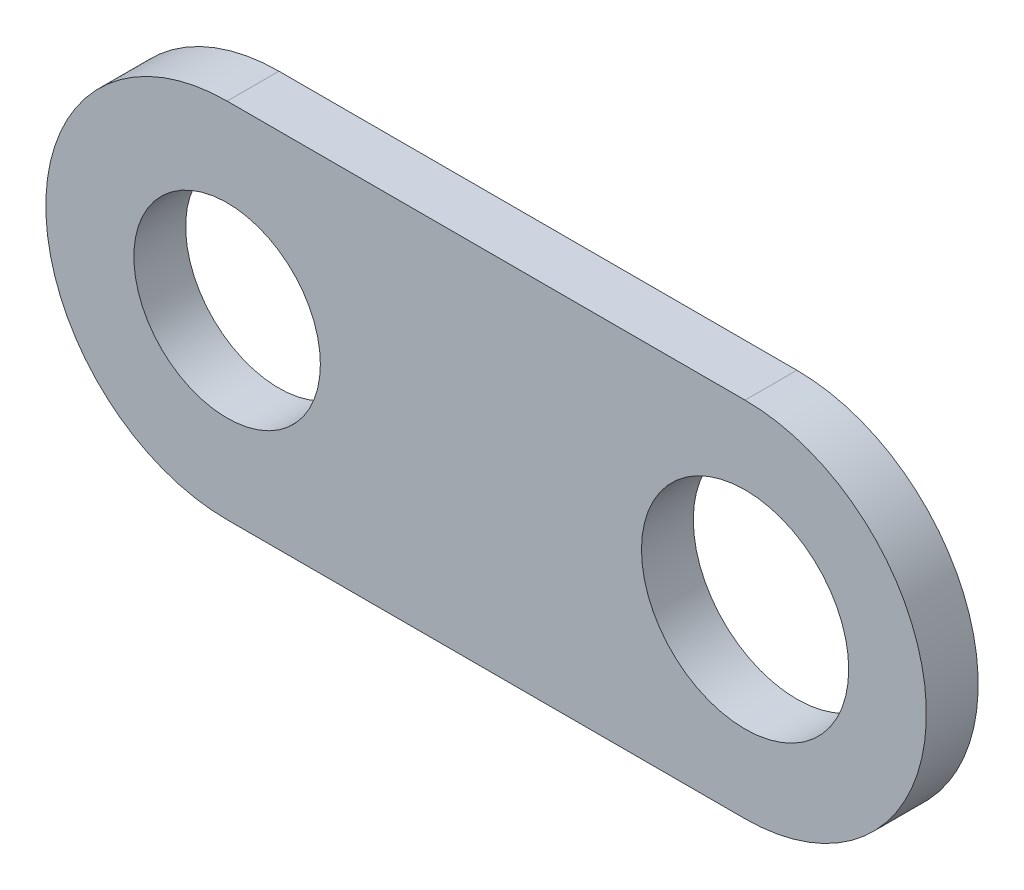
ISO-10303-21;
HEADER;
FILE_DESCRIPTION(('STEP AP214'),'2;1');
FILE_NAME('part.step','',(''),(''),'','','');
FILE_SCHEMA(('AUTOMOTIVE_DESIGN { 1 0 10303 214 1 1 1 1 }'));
ENDSEC;
DATA;
#1=APPLICATION_CONTEXT('core data for automotive mechanical design processes');
#2=APPLICATION_PROTOCOL_DEFINITION('international standard','automotive_design',2000,#1);
#3=PRODUCT_CONTEXT('',#1,'mechanical');
#4=PRODUCT('Part','Part','',(#3));
#5=PRODUCT_RELATED_PRODUCT_CATEGORY('part','',(#4));
#6=PRODUCT_DEFINITION_FORMATION('','',#4);
#7=PRODUCT_DEFINITION_CONTEXT('part definition',#1,'design');
#8=PRODUCT_DEFINITION('design','',#6,#7);
#9=PRODUCT_DEFINITION_SHAPE('','',#8);
#10=(LENGTH_UNIT() NAMED_UNIT(*) SI_UNIT(.MILLI.,.METRE.));
#11=(NAMED_UNIT(*) PLANE_ANGLE_UNIT() SI_UNIT($,.RADIAN.));
#12=(NAMED_UNIT(*) SI_UNIT($,.STERADIAN.) SOLID_ANGLE_UNIT());
#13=UNCERTAINTY_MEASURE_WITH_UNIT(LENGTH_MEASURE(1.E-05),#10,'distance_accuracy_value','');
#14=(GEOMETRIC_REPRESENTATION_CONTEXT(3) GLOBAL_UNCERTAINTY_ASSIGNED_CONTEXT((#13)) GLOBAL_UNIT_ASSIGNED_CONTEXT((#10,
#11,#12)) REPRESENTATION_CONTEXT('',''));
#15=CARTESIAN_POINT('',(0.,0.,0.));
#16=DIRECTION('',(0.,0.,1.));
#17=DIRECTION('',(1.,0.,0.));
#18=AXIS2_PLACEMENT_3D('',#15,#16,#17);
#19=CARTESIAN_POINT('',(0.,0.,6.35));
#20=DIRECTION('',(0.,0.,-1.));
#21=DIRECTION('',(-1.,0.,0.));
#22=AXIS2_PLACEMENT_3D('',#19,#20,#21);
#23=CYLINDRICAL_SURFACE('',#22,22.225);
#24=CARTESIAN_POINT('',(0.,0.,0.));
#25=DIRECTION('',(0.,0.,1.));
#26=DIRECTION('',(1.,0.,0.));
#27=AXIS2_PLACEMENT_3D('',#24,#25,#26);
#28=CIRCLE('',#27,22.225);
#29=CARTESIAN_POINT('',(0.,22.225,0.));
#30=VERTEX_POINT('',#29);
#31=CARTESIAN_POINT('',(0.,-22.225,0.));
#32=VERTEX_POINT('',#31);
#33=EDGE_CURVE('E116',#30,#32,#28,.T.);
#34=ORIENTED_EDGE('',*,*,#33,.T.);
#35=DIRECTION('',(0.,0.,-1.));
#36=VECTOR('',#35,1.);
#37=CARTESIAN_POINT('',(0.,-22.225,6.35));
#38=LINE('',#37,#36);
#39=CARTESIAN_POINT('',(0.,-22.225,6.35));
#40=VERTEX_POINT('',#39);
#41=EDGE_CURVE('E11',#40,#32,#38,.T.);
#42=ORIENTED_EDGE('',*,*,#41,.F.);
#43=CARTESIAN_POINT('',(0.,0.,6.35));
#44=DIRECTION('',(0.,0.,1.));
#45=DIRECTION('',(1.,0.,0.));
#46=AXIS2_PLACEMENT_3D('',#43,#44,#45);
#47=CIRCLE('',#46,22.225);
#48=CARTESIAN_POINT('',(0.,22.225,6.35));
#49=VERTEX_POINT('',#48);
#50=EDGE_CURVE('E99',#49,#40,#47,.T.);
#51=ORIENTED_EDGE('',*,*,#50,.F.);
#52=DIRECTION('',(0.,0.,-1.));
#53=VECTOR('',#52,1.);
#54=CARTESIAN_POINT('',(0.,22.225,6.35));
#55=LINE('',#54,#53);
#56=EDGE_CURVE('E112',#49,#30,#55,.T.);
#57=ORIENTED_EDGE('',*,*,#56,.T.);
#58=EDGE_LOOP('',(#34,#42,#51,#57));
#59=FACE_BOUND('',#58,.T.);
#60=ADVANCED_FACE('F47',(#59),#23,.T.);
#61=CARTESIAN_POINT('',(0.,-22.225,6.35));
#62=DIRECTION('',(0.,1.,0.));
#63=DIRECTION('',(0.,0.,1.));
#64=AXIS2_PLACEMENT_3D('',#61,#62,#63);
#65=PLANE('',#64);
#66=DIRECTION('',(1.,0.,0.));
#67=VECTOR('',#66,1.);
#68=CARTESIAN_POINT('',(0.,-22.225,0.));
#69=LINE('',#68,#67);
#70=CARTESIAN_POINT('',(63.5,-22.225,0.));
#71=VERTEX_POINT('',#70);
#72=EDGE_CURVE('E104',#32,#71,#69,.T.);
#73=ORIENTED_EDGE('',*,*,#72,.T.);
#74=DIRECTION('',(0.,0.,-1.));
#75=VECTOR('',#74,1.);
#76=CARTESIAN_POINT('',(63.5,-22.225,6.35));
#77=LINE('',#76,#75);
#78=CARTESIAN_POINT('',(63.5,-22.225,6.35));
#79=VERTEX_POINT('',#78);
#80=EDGE_CURVE('E56',#79,#71,#77,.T.);
#81=ORIENTED_EDGE('',*,*,#80,.F.);
#82=DIRECTION('',(1.,0.,0.));
#83=VECTOR('',#82,1.);
#84=CARTESIAN_POINT('',(0.,-22.225,6.35));
#85=LINE('',#84,#83);
#86=EDGE_CURVE('E94',#40,#79,#85,.T.);
#87=ORIENTED_EDGE('',*,*,#86,.F.);
#88=ORIENTED_EDGE('',*,*,#41,.T.);
#89=EDGE_LOOP('',(#73,#81,#87,#88));
#90=FACE_BOUND('',#89,.T.);
#91=ADVANCED_FACE('F103',(#90),#65,.F.);
#92=CARTESIAN_POINT('',(63.5,0.,6.35));
#93=DIRECTION('',(0.,0.,-1.));
#94=DIRECTION('',(-1.,0.,0.));
#95=AXIS2_PLACEMENT_3D('',#92,#93,#94);
#96=CYLINDRICAL_SURFACE('',#95,22.225);
#97=CARTESIAN_POINT('',(63.5,0.,0.));
#98=DIRECTION('',(0.,0.,1.));
#99=DIRECTION('',(1.,0.,0.));
#100=AXIS2_PLACEMENT_3D('',#97,#98,#99);
#101=CIRCLE('',#100,22.225);
#102=CARTESIAN_POINT('',(63.5,22.225,0.));
#103=VERTEX_POINT('',#102);
#104=EDGE_CURVE('E81',#71,#103,#101,.T.);
#105=ORIENTED_EDGE('',*,*,#104,.T.);
#106=DIRECTION('',(0.,0.,-1.));
#107=VECTOR('',#106,1.);
#108=CARTESIAN_POINT('',(63.5,22.225,6.35));
#109=LINE('',#108,#107);
#110=CARTESIAN_POINT('',(63.5,22.225,6.35));
#111=VERTEX_POINT('',#110);
#112=EDGE_CURVE('E106',#111,#103,#109,.T.);
#113=ORIENTED_EDGE('',*,*,#112,.F.);
#114=CARTESIAN_POINT('',(63.5,0.,6.35));
#115=DIRECTION('',(0.,0.,1.));
#116=DIRECTION('',(1.,0.,0.));
#117=AXIS2_PLACEMENT_3D('',#114,#115,#116);
#118=CIRCLE('',#117,22.225);
#119=EDGE_CURVE('E97',#79,#111,#118,.T.);
#120=ORIENTED_EDGE('',*,*,#119,.F.);
#121=ORIENTED_EDGE('',*,*,#80,.T.);
#122=EDGE_LOOP('',(#105,#113,#120,#121));
#123=FACE_BOUND('',#122,.T.);
#124=ADVANCED_FACE('F107',(#123),#96,.T.);
#125=CARTESIAN_POINT('',(0.,22.225,6.35));
#126=DIRECTION('',(0.,-1.,0.));
#127=DIRECTION('',(0.,0.,-1.));
#128=AXIS2_PLACEMENT_3D('',#125,#126,#127);
#129=PLANE('',#128);
#130=DIRECTION('',(-1.,0.,0.));
#131=VECTOR('',#130,1.);
#132=CARTESIAN_POINT('',(0.,22.225,0.));
#133=LINE('',#132,#131);
#134=EDGE_CURVE('E87',#103,#30,#133,.T.);
#135=ORIENTED_EDGE('',*,*,#134,.T.);
#136=ORIENTED_EDGE('',*,*,#56,.F.);
#137=DIRECTION('',(-1.,0.,0.));
#138=VECTOR('',#137,1.);
#139=CARTESIAN_POINT('',(0.,22.225,6.35));
#140=LINE('',#139,#138);
#141=EDGE_CURVE('E64',#111,#49,#140,.T.);
#142=ORIENTED_EDGE('',*,*,#141,.F.);
#143=ORIENTED_EDGE('',*,*,#112,.T.);
#144=EDGE_LOOP('',(#135,#136,#142,#143));
#145=FACE_BOUND('',#144,.T.);
#146=ADVANCED_FACE('F131',(#145),#129,.F.);
#147=CARTESIAN_POINT('',(0.,0.,6.35));
#148=DIRECTION('',(0.,0.,1.));
#149=DIRECTION('',(1.,0.,0.));
#150=AXIS2_PLACEMENT_3D('',#147,#148,#149);
#151=PLANE('',#150);
#152=CARTESIAN_POINT('',(0.,0.,6.35));
#153=DIRECTION('',(0.,0.,1.));
#154=DIRECTION('',(1.,0.,0.));
#155=AXIS2_PLACEMENT_3D('',#152,#153,#154);
#156=CIRCLE('',#155,11.433175);
#157=CARTESIAN_POINT('',(11.433175,0.,6.35));
#158=VERTEX_POINT('',#157);
#159=EDGE_CURVE('E147',#158,#158,#156,.T.);
#160=ORIENTED_EDGE('',*,*,#159,.F.);
#161=EDGE_LOOP('',(#160));
#162=FACE_BOUND('',#161,.T.);
#163=CARTESIAN_POINT('',(63.5,0.,6.35));
#164=DIRECTION('',(0.,0.,1.));
#165=DIRECTION('',(1.,0.,0.));
#166=AXIS2_PLACEMENT_3D('',#163,#164,#165);
#167=CIRCLE('',#166,12.703175);
#168=CARTESIAN_POINT('',(76.203175,0.,6.35));
#169=VERTEX_POINT('',#168);
#170=EDGE_CURVE('E143',#169,#169,#167,.T.);
#171=ORIENTED_EDGE('',*,*,#170,.F.);
#172=EDGE_LOOP('',(#171));
#173=FACE_BOUND('',#172,.T.);
#174=ORIENTED_EDGE('',*,*,#50,.T.);
#175=ORIENTED_EDGE('',*,*,#86,.T.);
#176=ORIENTED_EDGE('',*,*,#119,.T.);
#177=ORIENTED_EDGE('',*,*,#141,.T.);
#178=EDGE_LOOP('',(#174,#175,#176,#177));
#179=FACE_BOUND('',#178,.T.);
#180=ADVANCED_FACE('F95',(#162,#173,#179),#151,.T.);
#181=CARTESIAN_POINT('',(0.,0.,0.));
#182=DIRECTION('',(0.,0.,1.));
#183=DIRECTION('',(1.,0.,0.));
#184=AXIS2_PLACEMENT_3D('',#181,#182,#183);
#185=PLANE('',#184);
#186=CARTESIAN_POINT('',(0.,0.,0.));
#187=DIRECTION('',(0.,0.,1.));
#188=DIRECTION('',(1.,0.,0.));
#189=AXIS2_PLACEMENT_3D('',#186,#187,#188);
#190=CIRCLE('',#189,11.433175);
#191=CARTESIAN_POINT('',(11.433175,0.,0.));
#192=VERTEX_POINT('',#191);
#193=EDGE_CURVE('E120',#192,#192,#190,.T.);
#194=ORIENTED_EDGE('',*,*,#193,.T.);
#195=EDGE_LOOP('',(#194));
#196=FACE_BOUND('',#195,.T.);
#197=CARTESIAN_POINT('',(63.5,0.,0.));
#198=DIRECTION('',(0.,0.,1.));
#199=DIRECTION('',(1.,0.,0.));
#200=AXIS2_PLACEMENT_3D('',#197,#198,#199);
#201=CIRCLE('',#200,12.703175);
#202=CARTESIAN_POINT('',(76.203175,0.,0.));
#203=VERTEX_POINT('',#202);
#204=EDGE_CURVE('E139',#203,#203,#201,.T.);
#205=ORIENTED_EDGE('',*,*,#204,.T.);
#206=EDGE_LOOP('',(#205));
#207=FACE_BOUND('',#206,.T.);
#208=ORIENTED_EDGE('',*,*,#33,.F.);
#209=ORIENTED_EDGE('',*,*,#134,.F.);
#210=ORIENTED_EDGE('',*,*,#104,.F.);
#211=ORIENTED_EDGE('',*,*,#72,.F.);
#212=EDGE_LOOP('',(#208,#209,#210,#211));
#213=FACE_BOUND('',#212,.T.);
#214=ADVANCED_FACE('F134',(#196,#207,#213),#185,.F.);
#215=CARTESIAN_POINT('',(63.5,0.,0.));
#216=DIRECTION('',(0.,0.,1.));
#217=DIRECTION('',(1.,0.,0.));
#218=AXIS2_PLACEMENT_3D('',#215,#216,#217);
#219=CYLINDRICAL_SURFACE('',#218,12.703175);
#220=ORIENTED_EDGE('',*,*,#204,.F.);
#221=EDGE_LOOP('',(#220));
#222=FACE_BOUND('',#221,.T.);
#223=ORIENTED_EDGE('',*,*,#170,.T.);
#224=EDGE_LOOP('',(#223));
#225=FACE_BOUND('',#224,.T.);
#226=ADVANCED_FACE('F161',(#222,#225),#219,.F.);
#227=CARTESIAN_POINT('',(0.,0.,0.));
#228=DIRECTION('',(0.,0.,1.));
#229=DIRECTION('',(1.,0.,0.));
#230=AXIS2_PLACEMENT_3D('',#227,#228,#229);
#231=CYLINDRICAL_SURFACE('',#230,11.433175);
#232=ORIENTED_EDGE('',*,*,#193,.F.);
#233=EDGE_LOOP('',(#232));
#234=FACE_BOUND('',#233,.T.);
#235=ORIENTED_EDGE('',*,*,#159,.T.);
#236=EDGE_LOOP('',(#235));
#237=FACE_BOUND('',#236,.T.);
#238=ADVANCED_FACE('F158',(#234,#237),#231,.F.);
#239=CLOSED_SHELL('',(#60,#91,#124,#146,#180,#214,#226,#238));
#240=MANIFOLD_SOLID_BREP('B2',#239);
#241=ADVANCED_BREP_SHAPE_REPRESENTATION('',(#18,#240),#14);
#242=SHAPE_DEFINITION_REPRESENTATION(#9,#241);
ENDSEC;
END-ISO-10303-21;
